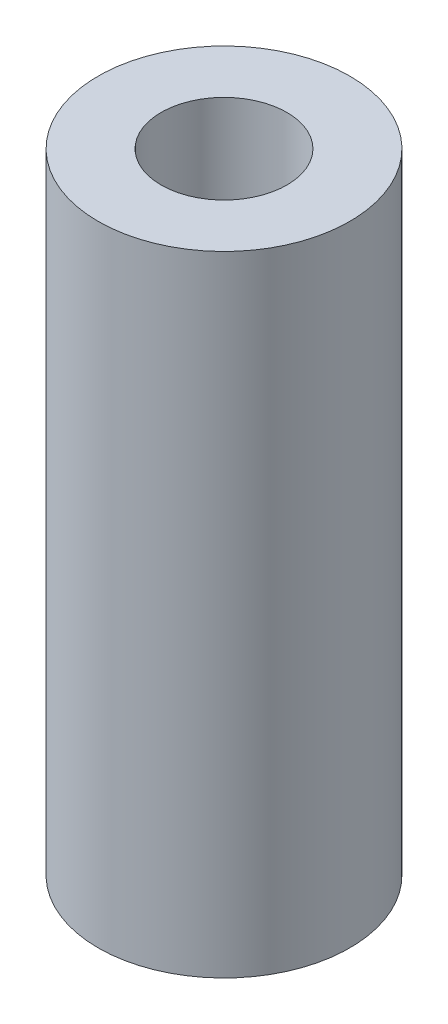
ISO-10303-21;
HEADER;
FILE_DESCRIPTION(('STEP AP214'),'2;1');
FILE_NAME('part.step','',(''),(''),'','','');
FILE_SCHEMA(('AUTOMOTIVE_DESIGN { 1 0 10303 214 1 1 1 1 }'));
ENDSEC;
DATA;
#1=APPLICATION_CONTEXT('core data for automotive mechanical design processes');
#2=APPLICATION_PROTOCOL_DEFINITION('international standard','automotive_design',2000,#1);
#3=PRODUCT_CONTEXT('',#1,'mechanical');
#4=PRODUCT('Part','Part','',(#3));
#5=PRODUCT_RELATED_PRODUCT_CATEGORY('part','',(#4));
#6=PRODUCT_DEFINITION_FORMATION('','',#4);
#7=PRODUCT_DEFINITION_CONTEXT('part definition',#1,'design');
#8=PRODUCT_DEFINITION('design','',#6,#7);
#9=PRODUCT_DEFINITION_SHAPE('','',#8);
#10=(LENGTH_UNIT() NAMED_UNIT(*) SI_UNIT(.MILLI.,.METRE.));
#11=(NAMED_UNIT(*) PLANE_ANGLE_UNIT() SI_UNIT($,.RADIAN.));
#12=(NAMED_UNIT(*) SI_UNIT($,.STERADIAN.) SOLID_ANGLE_UNIT());
#13=UNCERTAINTY_MEASURE_WITH_UNIT(LENGTH_MEASURE(1.E-05),#10,'distance_accuracy_value','');
#14=(GEOMETRIC_REPRESENTATION_CONTEXT(3) GLOBAL_UNCERTAINTY_ASSIGNED_CONTEXT((#13)) GLOBAL_UNIT_ASSIGNED_CONTEXT((#10,
#11,#12)) REPRESENTATION_CONTEXT('',''));
#15=CARTESIAN_POINT('',(0.,0.,0.));
#16=DIRECTION('',(0.,0.,1.));
#17=DIRECTION('',(1.,0.,0.));
#18=AXIS2_PLACEMENT_3D('',#15,#16,#17);
#19=CARTESIAN_POINT('',(0.,31.75,0.));
#20=DIRECTION('',(0.,1.,0.));
#21=DIRECTION('',(0.,0.,1.));
#22=AXIS2_PLACEMENT_3D('',#19,#20,#21);
#23=PLANE('',#22);
#24=CARTESIAN_POINT('',(0.,31.75,0.));
#25=DIRECTION('',(0.,1.,0.));
#26=DIRECTION('',(0.,0.,1.));
#27=AXIS2_PLACEMENT_3D('',#24,#25,#26);
#28=CIRCLE('',#27,6.35);
#29=CARTESIAN_POINT('',(0.,31.75,6.35));
#30=VERTEX_POINT('',#29);
#31=EDGE_CURVE('E10',#30,#30,#28,.T.);
#32=ORIENTED_EDGE('',*,*,#31,.T.);
#33=EDGE_LOOP('',(#32));
#34=FACE_BOUND('',#33,.T.);
#35=CARTESIAN_POINT('',(0.,31.75,0.));
#36=DIRECTION('',(0.,1.,0.));
#37=DIRECTION('',(0.,0.,1.));
#38=AXIS2_PLACEMENT_3D('',#35,#36,#37);
#39=CIRCLE('',#38,3.175);
#40=CARTESIAN_POINT('',(0.,31.75,3.175));
#41=VERTEX_POINT('',#40);
#42=EDGE_CURVE('E43',#41,#41,#39,.T.);
#43=ORIENTED_EDGE('',*,*,#42,.F.);
#44=EDGE_LOOP('',(#43));
#45=FACE_BOUND('',#44,.T.);
#46=ADVANCED_FACE('F32',(#34,#45),#23,.T.);
#47=CARTESIAN_POINT('',(0.,0.,0.));
#48=DIRECTION('',(0.,1.,0.));
#49=DIRECTION('',(0.,0.,1.));
#50=AXIS2_PLACEMENT_3D('',#47,#48,#49);
#51=PLANE('',#50);
#52=CARTESIAN_POINT('',(0.,0.,0.));
#53=DIRECTION('',(0.,1.,0.));
#54=DIRECTION('',(0.,0.,1.));
#55=AXIS2_PLACEMENT_3D('',#52,#53,#54);
#56=CIRCLE('',#55,6.35);
#57=CARTESIAN_POINT('',(0.,0.,6.35));
#58=VERTEX_POINT('',#57);
#59=EDGE_CURVE('E36',#58,#58,#56,.T.);
#60=ORIENTED_EDGE('',*,*,#59,.F.);
#61=EDGE_LOOP('',(#60));
#62=FACE_BOUND('',#61,.T.);
#63=CARTESIAN_POINT('',(0.,0.,0.));
#64=DIRECTION('',(0.,1.,0.));
#65=DIRECTION('',(0.,0.,1.));
#66=AXIS2_PLACEMENT_3D('',#63,#64,#65);
#67=CIRCLE('',#66,3.175);
#68=CARTESIAN_POINT('',(0.,0.,3.175));
#69=VERTEX_POINT('',#68);
#70=EDGE_CURVE('E45',#69,#69,#67,.T.);
#71=ORIENTED_EDGE('',*,*,#70,.T.);
#72=EDGE_LOOP('',(#71));
#73=FACE_BOUND('',#72,.T.);
#74=ADVANCED_FACE('F55',(#62,#73),#51,.F.);
#75=CARTESIAN_POINT('',(0.,31.75,0.));
#76=DIRECTION('',(0.,-1.,0.));
#77=DIRECTION('',(0.,0.,-1.));
#78=AXIS2_PLACEMENT_3D('',#75,#76,#77);
#79=CYLINDRICAL_SURFACE('',#78,6.35);
#80=ORIENTED_EDGE('',*,*,#31,.F.);
#81=EDGE_LOOP('',(#80));
#82=FACE_BOUND('',#81,.T.);
#83=ORIENTED_EDGE('',*,*,#59,.T.);
#84=EDGE_LOOP('',(#83));
#85=FACE_BOUND('',#84,.T.);
#86=ADVANCED_FACE('F34',(#82,#85),#79,.T.);
#87=CARTESIAN_POINT('',(0.,31.75,0.));
#88=DIRECTION('',(0.,-1.,0.));
#89=DIRECTION('',(0.,0.,-1.));
#90=AXIS2_PLACEMENT_3D('',#87,#88,#89);
#91=CYLINDRICAL_SURFACE('',#90,3.175);
#92=ORIENTED_EDGE('',*,*,#42,.T.);
#93=EDGE_LOOP('',(#92));
#94=FACE_BOUND('',#93,.T.);
#95=ORIENTED_EDGE('',*,*,#70,.F.);
#96=EDGE_LOOP('',(#95));
#97=FACE_BOUND('',#96,.T.);
#98=ADVANCED_FACE('F51',(#94,#97),#91,.F.);
#99=CLOSED_SHELL('',(#46,#74,#86,#98));
#100=MANIFOLD_SOLID_BREP('B2',#99);
#101=ADVANCED_BREP_SHAPE_REPRESENTATION('',(#18,#100),#14);
#102=SHAPE_DEFINITION_REPRESENTATION(#9,#101);
ENDSEC;
END-ISO-10303-21;
